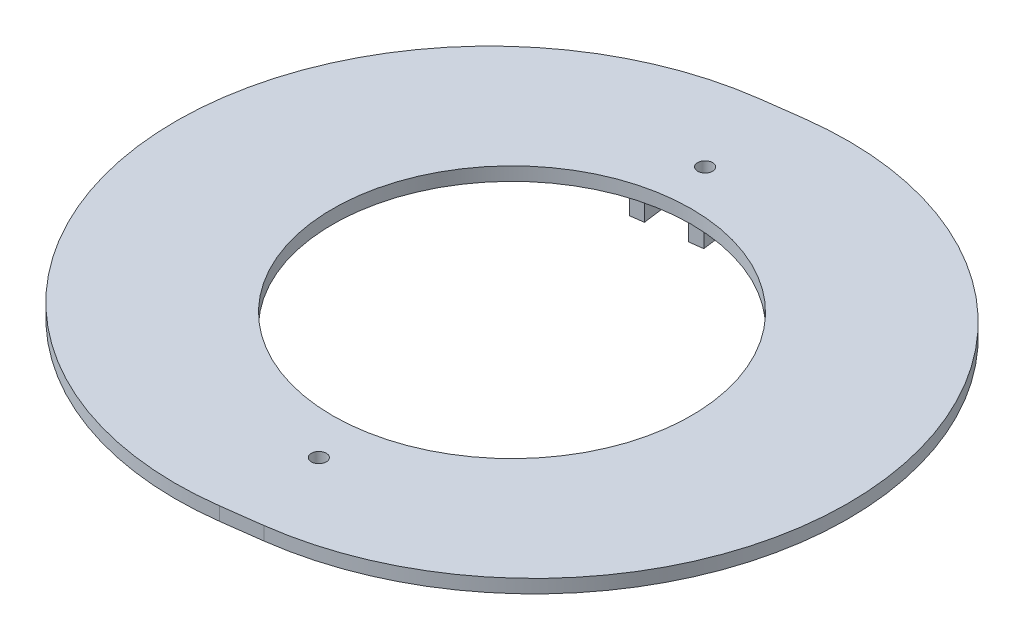
ISO-10303-21;
HEADER;
FILE_DESCRIPTION(('STEP AP214'),'2;1');
FILE_NAME('part.step','',(''),(''),'','','');
FILE_SCHEMA(('AUTOMOTIVE_DESIGN { 1 0 10303 214 1 1 1 1 }'));
ENDSEC;
DATA;
#1=APPLICATION_CONTEXT('core data for automotive mechanical design processes');
#2=APPLICATION_PROTOCOL_DEFINITION('international standard','automotive_design',2000,#1);
#3=PRODUCT_CONTEXT('',#1,'mechanical');
#4=PRODUCT('Part','Part','',(#3));
#5=PRODUCT_RELATED_PRODUCT_CATEGORY('part','',(#4));
#6=PRODUCT_DEFINITION_FORMATION('','',#4);
#7=PRODUCT_DEFINITION_CONTEXT('part definition',#1,'design');
#8=PRODUCT_DEFINITION('design','',#6,#7);
#9=PRODUCT_DEFINITION_SHAPE('','',#8);
#10=(LENGTH_UNIT() NAMED_UNIT(*) SI_UNIT(.MILLI.,.METRE.));
#11=(NAMED_UNIT(*) PLANE_ANGLE_UNIT() SI_UNIT($,.RADIAN.));
#12=(NAMED_UNIT(*) SI_UNIT($,.STERADIAN.) SOLID_ANGLE_UNIT());
#13=UNCERTAINTY_MEASURE_WITH_UNIT(LENGTH_MEASURE(1.E-05),#10,'distance_accuracy_value','');
#14=(GEOMETRIC_REPRESENTATION_CONTEXT(3) GLOBAL_UNCERTAINTY_ASSIGNED_CONTEXT((#13)) GLOBAL_UNIT_ASSIGNED_CONTEXT((#10,
#11,#12)) REPRESENTATION_CONTEXT('',''));
#15=CARTESIAN_POINT('',(0.,0.,0.));
#16=DIRECTION('',(0.,0.,1.));
#17=DIRECTION('',(1.,0.,0.));
#18=AXIS2_PLACEMENT_3D('',#15,#16,#17);
#19=CARTESIAN_POINT('',(-2.2,32.0962976066643,3.6));
#20=DIRECTION('',(0.,1.,0.));
#21=DIRECTION('',(0.,0.,1.));
#22=AXIS2_PLACEMENT_3D('',#19,#20,#21);
#23=PLANE('',#22);
#24=DIRECTION('',(-0.991444861373811,0.,0.130526192220043));
#25=VECTOR('',#24,1.);
#26=CARTESIAN_POINT('',(-0.451723656398434,32.0962976066643,-16.830232105287));
#27=LINE('',#26,#25);
#28=CARTESIAN_POINT('',(1.03544363566241,32.0962976066643,-17.0260213936171));
#29=VERTEX_POINT('',#28);
#30=CARTESIAN_POINT('',(-0.451723656398434,32.0962976066643,-16.830232105287));
#31=VERTEX_POINT('',#30);
#32=EDGE_CURVE('E191',#29,#31,#27,.T.);
#33=ORIENTED_EDGE('',*,*,#32,.F.);
#34=DIRECTION('',(0.130526192220045,0.,0.991444861373811));
#35=VECTOR('',#34,1.);
#36=CARTESIAN_POINT('',(1.03544363566241,32.0962976066643,-17.0260213936171));
#37=LINE('',#36,#35);
#38=CARTESIAN_POINT('',(0.382812674562175,32.0962976066643,-21.9832457004862));
#39=VERTEX_POINT('',#38);
#40=EDGE_CURVE('E204',#39,#29,#37,.T.);
#41=ORIENTED_EDGE('',*,*,#40,.F.);
#42=DIRECTION('',(0.991444861373811,0.,-0.130526192220045));
#43=VECTOR('',#42,1.);
#44=CARTESIAN_POINT('',(-1.10435461749866,32.0962976066643,-21.7874564121561));
#45=LINE('',#44,#43);
#46=CARTESIAN_POINT('',(-1.10435461749866,32.0962976066643,-21.7874564121561));
#47=VERTEX_POINT('',#46);
#48=EDGE_CURVE('E213',#47,#39,#45,.T.);
#49=ORIENTED_EDGE('',*,*,#48,.F.);
#50=DIRECTION('',(-0.130526192220045,0.,-0.991444861373811));
#51=VECTOR('',#50,1.);
#52=CARTESIAN_POINT('',(-0.451723656398434,32.0962976066643,-16.830232105287));
#53=LINE('',#52,#51);
#54=EDGE_CURVE('E194',#31,#47,#53,.T.);
#55=ORIENTED_EDGE('',*,*,#54,.F.);
#56=EDGE_LOOP('',(#33,#41,#49,#55));
#57=FACE_BOUND('',#56,.T.);
#58=DIRECTION('',(-0.991444861373812,0.,0.130526192220043));
#59=VECTOR('',#58,1.);
#60=CARTESIAN_POINT('',(1.06671200754344,32.0962976066643,28.4131411663879));
#61=LINE('',#60,#59);
#62=CARTESIAN_POINT('',(1.06671200754344,32.0962976066643,28.4131411663879));
#63=VERTEX_POINT('',#62);
#64=CARTESIAN_POINT('',(-0.420455284517288,32.0962976066643,28.6089304547179));
#65=VERTEX_POINT('',#64);
#66=EDGE_CURVE('E262',#63,#65,#61,.T.);
#67=ORIENTED_EDGE('',*,*,#66,.F.);
#68=DIRECTION('',(0.130526192220045,0.,0.991444861373811));
#69=VECTOR('',#68,1.);
#70=CARTESIAN_POINT('',(1.06671200754344,32.0962976066643,28.4131411663879));
#71=LINE('',#70,#69);
#72=CARTESIAN_POINT('',(0.414081046443206,32.0962976066643,23.4559168595188));
#73=VERTEX_POINT('',#72);
#74=EDGE_CURVE('E267',#73,#63,#71,.T.);
#75=ORIENTED_EDGE('',*,*,#74,.F.);
#76=DIRECTION('',(0.991444861373811,0.,-0.130526192220042));
#77=VECTOR('',#76,1.);
#78=CARTESIAN_POINT('',(0.414081046443217,32.0962976066643,23.4559168595188));
#79=LINE('',#78,#77);
#80=CARTESIAN_POINT('',(-1.0730862456175,32.0962976066643,23.6517061478489));
#81=VERTEX_POINT('',#80);
#82=EDGE_CURVE('E279',#81,#73,#79,.T.);
#83=ORIENTED_EDGE('',*,*,#82,.F.);
#84=DIRECTION('',(-0.130526192220043,0.,-0.991444861373811));
#85=VECTOR('',#84,1.);
#86=CARTESIAN_POINT('',(-0.420455284517288,32.0962976066643,28.6089304547179));
#87=LINE('',#86,#85);
#88=EDGE_CURVE('E276',#65,#81,#87,.T.);
#89=ORIENTED_EDGE('',*,*,#88,.F.);
#90=EDGE_LOOP('',(#67,#75,#83,#89));
#91=FACE_BOUND('',#90,.T.);
#92=CARTESIAN_POINT('',(-2.2,32.0962976066643,3.6));
#93=DIRECTION('',(0.,1.,0.));
#94=DIRECTION('',(0.,0.,1.));
#95=AXIS2_PLACEMENT_3D('',#92,#93,#94);
#96=CIRCLE('',#95,35.0272527833824);
#97=CARTESIAN_POINT('',(-6.77197392974388,32.0962976066643,-31.127589780126));
#98=VERTEX_POINT('',#97);
#99=CARTESIAN_POINT('',(2.3719739297439,32.0962976066643,38.327589780126));
#100=VERTEX_POINT('',#99);
#101=EDGE_CURVE('E311',#98,#100,#96,.T.);
#102=ORIENTED_EDGE('',*,*,#101,.F.);
#103=DIRECTION('',(-0.991444861373811,0.,0.130526192220046));
#104=VECTOR('',#103,1.);
#105=CARTESIAN_POINT('',(-6.77197392974388,32.0962976066643,-31.127589780126));
#106=LINE('',#105,#104);
#107=CARTESIAN_POINT('',(-2.40961653969911,32.0962976066643,-31.7019050258942));
#108=VERTEX_POINT('',#107);
#109=EDGE_CURVE('E318',#108,#98,#106,.T.);
#110=ORIENTED_EDGE('',*,*,#109,.F.);
#111=CARTESIAN_POINT('',(2.16235739004478,32.0962976066643,3.0256847542318));
#112=DIRECTION('',(0.,1.,0.));
#113=DIRECTION('',(0.,0.,-1.));
#114=AXIS2_PLACEMENT_3D('',#111,#112,#113);
#115=CIRCLE('',#114,35.0272527833824);
#116=CARTESIAN_POINT('',(6.73433131978867,32.0962976066643,37.7532745343578));
#117=VERTEX_POINT('',#116);
#118=EDGE_CURVE('E329',#117,#108,#115,.T.);
#119=ORIENTED_EDGE('',*,*,#118,.F.);
#120=DIRECTION('',(0.991444861373812,0.,-0.130526192220043));
#121=VECTOR('',#120,1.);
#122=CARTESIAN_POINT('',(2.3719739297439,32.0962976066643,38.327589780126));
#123=LINE('',#122,#121);
#124=EDGE_CURVE('E327',#100,#117,#123,.T.);
#125=ORIENTED_EDGE('',*,*,#124,.F.);
#126=EDGE_LOOP('',(#102,#110,#119,#125));
#127=FACE_BOUND('',#126,.T.);
#128=CARTESIAN_POINT('',(-0.01882130497761,32.0962976066643,3.3128423771159));
#129=DIRECTION('',(0.,1.,0.));
#130=DIRECTION('',(0.,0.,1.));
#131=AXIS2_PLACEMENT_3D('',#128,#129,#130);
#132=CIRCLE('',#131,20.);
#133=CARTESIAN_POINT('',(-0.01882130497761,32.0962976066643,23.3128423771159));
#134=VERTEX_POINT('',#133);
#135=EDGE_CURVE('E305',#134,#134,#132,.T.);
#136=ORIENTED_EDGE('',*,*,#135,.T.);
#137=EDGE_LOOP('',(#136));
#138=FACE_BOUND('',#137,.T.);
#139=CARTESIAN_POINT('',(3.24789070256586,32.0962976066643,28.1259835435038));
#140=DIRECTION('',(0.,1.,0.));
#141=DIRECTION('',(0.,0.,1.));
#142=AXIS2_PLACEMENT_3D('',#139,#140,#141);
#143=CIRCLE('',#142,0.835999999999999);
#144=CARTESIAN_POINT('',(3.24789070256586,32.0962976066643,28.9619835435038));
#145=VERTEX_POINT('',#144);
#146=EDGE_CURVE('E299',#145,#145,#143,.T.);
#147=ORIENTED_EDGE('',*,*,#146,.T.);
#148=EDGE_LOOP('',(#147));
#149=FACE_BOUND('',#148,.T.);
#150=CARTESIAN_POINT('',(-3.28553331252106,32.0962976066643,-21.500298789272));
#151=DIRECTION('',(0.,1.,0.));
#152=DIRECTION('',(0.,0.,1.));
#153=AXIS2_PLACEMENT_3D('',#150,#151,#152);
#154=CIRCLE('',#153,0.836);
#155=CARTESIAN_POINT('',(-3.28553331252106,32.0962976066643,-20.664298789272));
#156=VERTEX_POINT('',#155);
#157=EDGE_CURVE('E295',#156,#156,#154,.T.);
#158=ORIENTED_EDGE('',*,*,#157,.T.);
#159=EDGE_LOOP('',(#158));
#160=FACE_BOUND('',#159,.T.);
#161=DIRECTION('',(-0.991444861373812,0.,0.130526192220041));
#162=VECTOR('',#161,1.);
#163=CARTESIAN_POINT('',(5.42906939758822,32.0962976066643,27.8388259206197));
#164=LINE('',#163,#162);
#165=CARTESIAN_POINT('',(6.91623668964892,32.0962976066643,27.6430366322896));
#166=VERTEX_POINT('',#165);
#167=CARTESIAN_POINT('',(5.42906939758822,32.0962976066643,27.8388259206197));
#168=VERTEX_POINT('',#167);
#169=EDGE_CURVE('E229',#166,#168,#164,.T.);
#170=ORIENTED_EDGE('',*,*,#169,.F.);
#171=DIRECTION('',(0.130526192220043,0.,0.991444861373811));
#172=VECTOR('',#171,1.);
#173=CARTESIAN_POINT('',(6.91623668964892,32.0962976066643,27.6430366322896));
#174=LINE('',#173,#172);
#175=CARTESIAN_POINT('',(6.26360572854871,32.0962976066643,22.6858123254206));
#176=VERTEX_POINT('',#175);
#177=EDGE_CURVE('E234',#176,#166,#174,.T.);
#178=ORIENTED_EDGE('',*,*,#177,.F.);
#179=DIRECTION('',(0.991444861373812,0.,-0.130526192220037));
#180=VECTOR('',#179,1.);
#181=CARTESIAN_POINT('',(4.77643843648799,32.0962976066643,22.8816016137506));
#182=LINE('',#181,#180);
#183=CARTESIAN_POINT('',(4.77643843648799,32.0962976066643,22.8816016137506));
#184=VERTEX_POINT('',#183);
#185=EDGE_CURVE('E246',#184,#176,#182,.T.);
#186=ORIENTED_EDGE('',*,*,#185,.F.);
#187=DIRECTION('',(-0.130526192220045,0.,-0.991444861373811));
#188=VECTOR('',#187,1.);
#189=CARTESIAN_POINT('',(5.42906939758822,32.0962976066643,27.8388259206197));
#190=LINE('',#189,#188);
#191=EDGE_CURVE('E243',#168,#184,#190,.T.);
#192=ORIENTED_EDGE('',*,*,#191,.F.);
#193=EDGE_LOOP('',(#170,#178,#186,#192));
#194=FACE_BOUND('',#193,.T.);
#195=DIRECTION('',(0.991444861373811,0.,-0.130526192220046));
#196=VECTOR('',#195,1.);
#197=CARTESIAN_POINT('',(-5.46671200754343,32.0962976066643,-21.2131411663879));
#198=LINE('',#197,#196);
#199=CARTESIAN_POINT('',(-6.953879299604,32.0962976066643,-21.0173518780579));
#200=VERTEX_POINT('',#199);
#201=CARTESIAN_POINT('',(-5.46671200754342,32.0962976066643,-21.2131411663879));
#202=VERTEX_POINT('',#201);
#203=EDGE_CURVE('E190',#200,#202,#198,.T.);
#204=ORIENTED_EDGE('',*,*,#203,.F.);
#205=DIRECTION('',(-0.130526192220045,0.,-0.991444861373811));
#206=VECTOR('',#205,1.);
#207=CARTESIAN_POINT('',(-6.953879299604,32.0962976066643,-21.0173518780579));
#208=LINE('',#207,#206);
#209=CARTESIAN_POINT('',(-6.30124833850378,32.0962976066643,-16.0601275711888));
#210=VERTEX_POINT('',#209);
#211=EDGE_CURVE('E187',#210,#200,#208,.T.);
#212=ORIENTED_EDGE('',*,*,#211,.F.);
#213=DIRECTION('',(-0.991444861373811,0.,0.130526192220046));
#214=VECTOR('',#213,1.);
#215=CARTESIAN_POINT('',(-4.81408104644321,32.0962976066643,-16.2559168595188));
#216=LINE('',#215,#214);
#217=CARTESIAN_POINT('',(-4.81408104644321,32.0962976066643,-16.2559168595188));
#218=VERTEX_POINT('',#217);
#219=EDGE_CURVE('E53',#218,#210,#216,.T.);
#220=ORIENTED_EDGE('',*,*,#219,.F.);
#221=DIRECTION('',(0.130526192220045,0.,0.991444861373811));
#222=VECTOR('',#221,1.);
#223=CARTESIAN_POINT('',(-5.46671200754343,32.0962976066643,-21.2131411663879));
#224=LINE('',#223,#222);
#225=EDGE_CURVE('E48',#202,#218,#224,.T.);
#226=ORIENTED_EDGE('',*,*,#225,.F.);
#227=EDGE_LOOP('',(#204,#212,#220,#226));
#228=FACE_BOUND('',#227,.T.);
#229=ADVANCED_FACE('F33',(#57,#91,#127,#138,#149,#160,#194,#228),#23,.F.);
#230=CARTESIAN_POINT('',(-2.2,33.5962976066643,3.6));
#231=DIRECTION('',(0.,1.,0.));
#232=DIRECTION('',(0.,0.,1.));
#233=AXIS2_PLACEMENT_3D('',#230,#231,#232);
#234=PLANE('',#233);
#235=CARTESIAN_POINT('',(3.24789070256586,33.5962976066643,28.1259835435038));
#236=DIRECTION('',(0.,1.,0.));
#237=DIRECTION('',(0.,0.,1.));
#238=AXIS2_PLACEMENT_3D('',#235,#236,#237);
#239=CIRCLE('',#238,0.835999999999999);
#240=CARTESIAN_POINT('',(3.24789070256586,33.5962976066643,28.9619835435038));
#241=VERTEX_POINT('',#240);
#242=EDGE_CURVE('E302',#241,#241,#239,.T.);
#243=ORIENTED_EDGE('',*,*,#242,.F.);
#244=EDGE_LOOP('',(#243));
#245=FACE_BOUND('',#244,.T.);
#246=CARTESIAN_POINT('',(-2.2,33.5962976066643,3.6));
#247=DIRECTION('',(0.,1.,0.));
#248=DIRECTION('',(0.,0.,1.));
#249=AXIS2_PLACEMENT_3D('',#246,#247,#248);
#250=CIRCLE('',#249,35.0272527833824);
#251=CARTESIAN_POINT('',(-6.77197392974388,33.5962976066643,-31.127589780126));
#252=VERTEX_POINT('',#251);
#253=CARTESIAN_POINT('',(2.3719739297439,33.5962976066643,38.327589780126));
#254=VERTEX_POINT('',#253);
#255=EDGE_CURVE('E314',#252,#254,#250,.T.);
#256=ORIENTED_EDGE('',*,*,#255,.T.);
#257=DIRECTION('',(0.991444861373812,0.,-0.130526192220043));
#258=VECTOR('',#257,1.);
#259=CARTESIAN_POINT('',(2.3719739297439,33.5962976066643,38.327589780126));
#260=LINE('',#259,#258);
#261=CARTESIAN_POINT('',(6.73433131978867,33.5962976066643,37.7532745343578));
#262=VERTEX_POINT('',#261);
#263=EDGE_CURVE('E317',#254,#262,#260,.T.);
#264=ORIENTED_EDGE('',*,*,#263,.T.);
#265=CARTESIAN_POINT('',(2.16235739004478,33.5962976066643,3.0256847542318));
#266=DIRECTION('',(0.,1.,0.));
#267=DIRECTION('',(0.,0.,-1.));
#268=AXIS2_PLACEMENT_3D('',#265,#266,#267);
#269=CIRCLE('',#268,35.0272527833824);
#270=CARTESIAN_POINT('',(-2.40961653969911,33.5962976066643,-31.7019050258942));
#271=VERTEX_POINT('',#270);
#272=EDGE_CURVE('E320',#262,#271,#269,.T.);
#273=ORIENTED_EDGE('',*,*,#272,.T.);
#274=DIRECTION('',(-0.991444861373811,0.,0.130526192220046));
#275=VECTOR('',#274,1.);
#276=CARTESIAN_POINT('',(-6.77197392974388,33.5962976066643,-31.127589780126));
#277=LINE('',#276,#275);
#278=EDGE_CURVE('E322',#271,#252,#277,.T.);
#279=ORIENTED_EDGE('',*,*,#278,.T.);
#280=EDGE_LOOP('',(#256,#264,#273,#279));
#281=FACE_BOUND('',#280,.T.);
#282=CARTESIAN_POINT('',(-0.01882130497761,33.5962976066643,3.3128423771159));
#283=DIRECTION('',(0.,1.,0.));
#284=DIRECTION('',(0.,0.,1.));
#285=AXIS2_PLACEMENT_3D('',#282,#283,#284);
#286=CIRCLE('',#285,20.);
#287=CARTESIAN_POINT('',(-0.01882130497761,33.5962976066643,23.3128423771159));
#288=VERTEX_POINT('',#287);
#289=EDGE_CURVE('E308',#288,#288,#286,.T.);
#290=ORIENTED_EDGE('',*,*,#289,.F.);
#291=EDGE_LOOP('',(#290));
#292=FACE_BOUND('',#291,.T.);
#293=CARTESIAN_POINT('',(-3.28553331252106,33.5962976066643,-21.500298789272));
#294=DIRECTION('',(0.,1.,0.));
#295=DIRECTION('',(0.,0.,1.));
#296=AXIS2_PLACEMENT_3D('',#293,#294,#295);
#297=CIRCLE('',#296,0.836);
#298=CARTESIAN_POINT('',(-3.28553331252106,33.5962976066643,-20.664298789272));
#299=VERTEX_POINT('',#298);
#300=EDGE_CURVE('E296',#299,#299,#297,.T.);
#301=ORIENTED_EDGE('',*,*,#300,.F.);
#302=EDGE_LOOP('',(#301));
#303=FACE_BOUND('',#302,.T.);
#304=ADVANCED_FACE('F356',(#245,#281,#292,#303),#234,.T.);
#305=CARTESIAN_POINT('',(-2.2,33.5962976066643,3.6));
#306=DIRECTION('',(0.,-1.,0.));
#307=DIRECTION('',(0.,0.,-1.));
#308=AXIS2_PLACEMENT_3D('',#305,#306,#307);
#309=CYLINDRICAL_SURFACE('',#308,35.0272527833824);
#310=ORIENTED_EDGE('',*,*,#101,.T.);
#311=DIRECTION('',(0.,-1.,0.));
#312=VECTOR('',#311,1.);
#313=CARTESIAN_POINT('',(2.3719739297439,33.5962976066643,38.327589780126));
#314=LINE('',#313,#312);
#315=EDGE_CURVE('E11',#254,#100,#314,.T.);
#316=ORIENTED_EDGE('',*,*,#315,.F.);
#317=ORIENTED_EDGE('',*,*,#255,.F.);
#318=DIRECTION('',(0.,-1.,0.));
#319=VECTOR('',#318,1.);
#320=CARTESIAN_POINT('',(-6.77197392974388,33.5962976066643,-31.127589780126));
#321=LINE('',#320,#319);
#322=EDGE_CURVE('E324',#252,#98,#321,.T.);
#323=ORIENTED_EDGE('',*,*,#322,.T.);
#324=EDGE_LOOP('',(#310,#316,#317,#323));
#325=FACE_BOUND('',#324,.T.);
#326=ADVANCED_FACE('F35',(#325),#309,.T.);
#327=CARTESIAN_POINT('',(2.3719739297439,33.5962976066643,38.327589780126));
#328=DIRECTION('',(-0.130526192220043,0.,-0.991444861373811));
#329=DIRECTION('',(-0.991444861373812,0.,0.130526192220043));
#330=AXIS2_PLACEMENT_3D('',#327,#328,#329);
#331=PLANE('',#330);
#332=ORIENTED_EDGE('',*,*,#124,.T.);
#333=DIRECTION('',(0.,-1.,0.));
#334=VECTOR('',#333,1.);
#335=CARTESIAN_POINT('',(6.73433131978867,33.5962976066643,37.7532745343578));
#336=LINE('',#335,#334);
#337=EDGE_CURVE('E41',#262,#117,#336,.T.);
#338=ORIENTED_EDGE('',*,*,#337,.F.);
#339=ORIENTED_EDGE('',*,*,#263,.F.);
#340=ORIENTED_EDGE('',*,*,#315,.T.);
#341=EDGE_LOOP('',(#332,#338,#339,#340));
#342=FACE_BOUND('',#341,.T.);
#343=ADVANCED_FACE('F358',(#342),#331,.F.);
#344=CARTESIAN_POINT('',(2.16235739004478,33.5962976066643,3.0256847542318));
#345=DIRECTION('',(0.,-1.,0.));
#346=DIRECTION('',(0.,0.,-1.));
#347=AXIS2_PLACEMENT_3D('',#344,#345,#346);
#348=CYLINDRICAL_SURFACE('',#347,35.0272527833824);
#349=ORIENTED_EDGE('',*,*,#118,.T.);
#350=DIRECTION('',(0.,-1.,0.));
#351=VECTOR('',#350,1.);
#352=CARTESIAN_POINT('',(-2.40961653969911,33.5962976066643,-31.7019050258942));
#353=LINE('',#352,#351);
#354=EDGE_CURVE('E334',#271,#108,#353,.T.);
#355=ORIENTED_EDGE('',*,*,#354,.F.);
#356=ORIENTED_EDGE('',*,*,#272,.F.);
#357=ORIENTED_EDGE('',*,*,#337,.T.);
#358=EDGE_LOOP('',(#349,#355,#356,#357));
#359=FACE_BOUND('',#358,.T.);
#360=ADVANCED_FACE('F341',(#359),#348,.T.);
#361=CARTESIAN_POINT('',(-6.77197392974388,33.5962976066643,-31.127589780126));
#362=DIRECTION('',(0.130526192220046,0.,0.991444861373811));
#363=DIRECTION('',(0.991444861373811,0.,-0.130526192220046));
#364=AXIS2_PLACEMENT_3D('',#361,#362,#363);
#365=PLANE('',#364);
#366=ORIENTED_EDGE('',*,*,#109,.T.);
#367=ORIENTED_EDGE('',*,*,#322,.F.);
#368=ORIENTED_EDGE('',*,*,#278,.F.);
#369=ORIENTED_EDGE('',*,*,#354,.T.);
#370=EDGE_LOOP('',(#366,#367,#368,#369));
#371=FACE_BOUND('',#370,.T.);
#372=ADVANCED_FACE('F350',(#371),#365,.F.);
#373=CARTESIAN_POINT('',(-0.01882130497761,33.5962976066643,3.3128423771159));
#374=DIRECTION('',(0.,-1.,0.));
#375=DIRECTION('',(0.,0.,-1.));
#376=AXIS2_PLACEMENT_3D('',#373,#374,#375);
#377=CYLINDRICAL_SURFACE('',#376,20.);
#378=ORIENTED_EDGE('',*,*,#289,.T.);
#379=EDGE_LOOP('',(#378));
#380=FACE_BOUND('',#379,.T.);
#381=ORIENTED_EDGE('',*,*,#135,.F.);
#382=EDGE_LOOP('',(#381));
#383=FACE_BOUND('',#382,.T.);
#384=ADVANCED_FACE('F377',(#380,#383),#377,.F.);
#385=CARTESIAN_POINT('',(3.24789070256586,33.5962976066643,28.1259835435038));
#386=DIRECTION('',(0.,-1.,0.));
#387=DIRECTION('',(0.,0.,-1.));
#388=AXIS2_PLACEMENT_3D('',#385,#386,#387);
#389=CYLINDRICAL_SURFACE('',#388,0.835999999999999);
#390=ORIENTED_EDGE('',*,*,#242,.T.);
#391=EDGE_LOOP('',(#390));
#392=FACE_BOUND('',#391,.T.);
#393=ORIENTED_EDGE('',*,*,#146,.F.);
#394=EDGE_LOOP('',(#393));
#395=FACE_BOUND('',#394,.T.);
#396=ADVANCED_FACE('F381',(#392,#395),#389,.F.);
#397=CARTESIAN_POINT('',(-3.28553331252106,33.5962976066643,-21.500298789272));
#398=DIRECTION('',(0.,-1.,0.));
#399=DIRECTION('',(0.,0.,-1.));
#400=AXIS2_PLACEMENT_3D('',#397,#398,#399);
#401=CYLINDRICAL_SURFACE('',#400,0.836);
#402=ORIENTED_EDGE('',*,*,#300,.T.);
#403=EDGE_LOOP('',(#402));
#404=FACE_BOUND('',#403,.T.);
#405=ORIENTED_EDGE('',*,*,#157,.F.);
#406=EDGE_LOOP('',(#405));
#407=FACE_BOUND('',#406,.T.);
#408=ADVANCED_FACE('F386',(#404,#407),#401,.F.);
#409=CARTESIAN_POINT('',(1.06671200754344,30.0962976066643,28.4131411663879));
#410=DIRECTION('',(-0.130526192220043,0.,-0.991444861373811));
#411=DIRECTION('',(-0.991444861373812,0.,0.130526192220043));
#412=AXIS2_PLACEMENT_3D('',#409,#410,#411);
#413=PLANE('',#412);
#414=ORIENTED_EDGE('',*,*,#66,.T.);
#415=DIRECTION('',(0.,1.,0.));
#416=VECTOR('',#415,1.);
#417=CARTESIAN_POINT('',(-0.420455284517288,30.0962976066643,28.6089304547179));
#418=LINE('',#417,#416);
#419=CARTESIAN_POINT('',(-0.420455284517288,30.0962976066643,28.6089304547179));
#420=VERTEX_POINT('',#419);
#421=EDGE_CURVE('E292',#420,#65,#418,.T.);
#422=ORIENTED_EDGE('',*,*,#421,.F.);
#423=DIRECTION('',(-0.991444861373812,0.,0.130526192220043));
#424=VECTOR('',#423,1.);
#425=CARTESIAN_POINT('',(1.06671200754344,30.0962976066643,28.4131411663879));
#426=LINE('',#425,#424);
#427=CARTESIAN_POINT('',(1.06671200754344,30.0962976066643,28.4131411663879));
#428=VERTEX_POINT('',#427);
#429=EDGE_CURVE('E263',#428,#420,#426,.T.);
#430=ORIENTED_EDGE('',*,*,#429,.F.);
#431=DIRECTION('',(0.,1.,0.));
#432=VECTOR('',#431,1.);
#433=CARTESIAN_POINT('',(1.06671200754344,30.0962976066643,28.4131411663879));
#434=LINE('',#433,#432);
#435=EDGE_CURVE('E273',#428,#63,#434,.T.);
#436=ORIENTED_EDGE('',*,*,#435,.T.);
#437=EDGE_LOOP('',(#414,#422,#430,#436));
#438=FACE_BOUND('',#437,.T.);
#439=ADVANCED_FACE('F393',(#438),#413,.F.);
#440=CARTESIAN_POINT('',(-0.420455284517288,30.0962976066643,28.6089304547179));
#441=DIRECTION('',(0.991444861373812,0.,-0.130526192220043));
#442=DIRECTION('',(-0.130526192220043,0.,-0.991444861373812));
#443=AXIS2_PLACEMENT_3D('',#440,#441,#442);
#444=PLANE('',#443);
#445=ORIENTED_EDGE('',*,*,#88,.T.);
#446=DIRECTION('',(0.,1.,0.));
#447=VECTOR('',#446,1.);
#448=CARTESIAN_POINT('',(-1.0730862456175,30.0962976066643,23.6517061478489));
#449=LINE('',#448,#447);
#450=CARTESIAN_POINT('',(-1.0730862456175,30.0962976066643,23.6517061478489));
#451=VERTEX_POINT('',#450);
#452=EDGE_CURVE('E289',#451,#81,#449,.T.);
#453=ORIENTED_EDGE('',*,*,#452,.F.);
#454=DIRECTION('',(-0.130526192220043,0.,-0.991444861373811));
#455=VECTOR('',#454,1.);
#456=CARTESIAN_POINT('',(-0.420455284517288,30.0962976066643,28.6089304547179));
#457=LINE('',#456,#455);
#458=EDGE_CURVE('E266',#420,#451,#457,.T.);
#459=ORIENTED_EDGE('',*,*,#458,.F.);
#460=ORIENTED_EDGE('',*,*,#421,.T.);
#461=EDGE_LOOP('',(#445,#453,#459,#460));
#462=FACE_BOUND('',#461,.T.);
#463=ADVANCED_FACE('F397',(#462),#444,.F.);
#464=CARTESIAN_POINT('',(0.414081046443217,30.0962976066643,23.4559168595188));
#465=DIRECTION('',(0.130526192220042,0.,0.991444861373812));
#466=DIRECTION('',(0.991444861373812,0.,-0.130526192220042));
#467=AXIS2_PLACEMENT_3D('',#464,#465,#466);
#468=PLANE('',#467);
#469=ORIENTED_EDGE('',*,*,#82,.T.);
#470=DIRECTION('',(0.,1.,0.));
#471=VECTOR('',#470,1.);
#472=CARTESIAN_POINT('',(0.414081046443217,30.0962976066643,23.4559168595188));
#473=LINE('',#472,#471);
#474=CARTESIAN_POINT('',(0.414081046443217,30.0962976066643,23.4559168595188));
#475=VERTEX_POINT('',#474);
#476=EDGE_CURVE('E286',#475,#73,#473,.T.);
#477=ORIENTED_EDGE('',*,*,#476,.F.);
#478=DIRECTION('',(0.991444861373811,0.,-0.130526192220042));
#479=VECTOR('',#478,1.);
#480=CARTESIAN_POINT('',(0.414081046443217,30.0962976066643,23.4559168595188));
#481=LINE('',#480,#479);
#482=EDGE_CURVE('E269',#451,#475,#481,.T.);
#483=ORIENTED_EDGE('',*,*,#482,.F.);
#484=ORIENTED_EDGE('',*,*,#452,.T.);
#485=EDGE_LOOP('',(#469,#477,#483,#484));
#486=FACE_BOUND('',#485,.T.);
#487=ADVANCED_FACE('F401',(#486),#468,.F.);
#488=CARTESIAN_POINT('',(1.06671200754344,30.0962976066643,28.4131411663879));
#489=DIRECTION('',(-0.991444861373811,0.,0.130526192220045));
#490=DIRECTION('',(0.130526192220045,0.,0.991444861373811));
#491=AXIS2_PLACEMENT_3D('',#488,#489,#490);
#492=PLANE('',#491);
#493=ORIENTED_EDGE('',*,*,#74,.T.);
#494=ORIENTED_EDGE('',*,*,#435,.F.);
#495=DIRECTION('',(0.130526192220045,0.,0.991444861373811));
#496=VECTOR('',#495,1.);
#497=CARTESIAN_POINT('',(1.06671200754344,30.0962976066643,28.4131411663879));
#498=LINE('',#497,#496);
#499=EDGE_CURVE('E271',#475,#428,#498,.T.);
#500=ORIENTED_EDGE('',*,*,#499,.F.);
#501=ORIENTED_EDGE('',*,*,#476,.T.);
#502=EDGE_LOOP('',(#493,#494,#500,#501));
#503=FACE_BOUND('',#502,.T.);
#504=ADVANCED_FACE('F405',(#503),#492,.F.);
#505=CARTESIAN_POINT('',(0.,30.0962976066643,0.));
#506=DIRECTION('',(0.,-1.,0.));
#507=DIRECTION('',(0.,0.,-1.));
#508=AXIS2_PLACEMENT_3D('',#505,#506,#507);
#509=PLANE('',#508);
#510=ORIENTED_EDGE('',*,*,#429,.T.);
#511=ORIENTED_EDGE('',*,*,#458,.T.);
#512=ORIENTED_EDGE('',*,*,#482,.T.);
#513=ORIENTED_EDGE('',*,*,#499,.T.);
#514=EDGE_LOOP('',(#510,#511,#512,#513));
#515=FACE_BOUND('',#514,.T.);
#516=ADVANCED_FACE('F409',(#515),#509,.T.);
#517=CARTESIAN_POINT('',(5.42906939758822,30.0962976066643,27.8388259206197));
#518=DIRECTION('',(-0.130526192220041,0.,-0.991444861373812));
#519=DIRECTION('',(-0.991444861373812,0.,0.130526192220041));
#520=AXIS2_PLACEMENT_3D('',#517,#518,#519);
#521=PLANE('',#520);
#522=ORIENTED_EDGE('',*,*,#169,.T.);
#523=DIRECTION('',(0.,1.,0.));
#524=VECTOR('',#523,1.);
#525=CARTESIAN_POINT('',(5.42906939758822,30.0962976066643,27.8388259206197));
#526=LINE('',#525,#524);
#527=CARTESIAN_POINT('',(5.42906939758822,30.0962976066643,27.8388259206197));
#528=VERTEX_POINT('',#527);
#529=EDGE_CURVE('E259',#528,#168,#526,.T.);
#530=ORIENTED_EDGE('',*,*,#529,.F.);
#531=DIRECTION('',(-0.991444861373812,0.,0.130526192220041));
#532=VECTOR('',#531,1.);
#533=CARTESIAN_POINT('',(5.42906939758822,30.0962976066643,27.8388259206197));
#534=LINE('',#533,#532);
#535=CARTESIAN_POINT('',(6.91623668964892,30.0962976066643,27.6430366322896));
#536=VERTEX_POINT('',#535);
#537=EDGE_CURVE('E230',#536,#528,#534,.T.);
#538=ORIENTED_EDGE('',*,*,#537,.F.);
#539=DIRECTION('',(0.,1.,0.));
#540=VECTOR('',#539,1.);
#541=CARTESIAN_POINT('',(6.91623668964892,30.0962976066643,27.6430366322896));
#542=LINE('',#541,#540);
#543=EDGE_CURVE('E240',#536,#166,#542,.T.);
#544=ORIENTED_EDGE('',*,*,#543,.T.);
#545=EDGE_LOOP('',(#522,#530,#538,#544));
#546=FACE_BOUND('',#545,.T.);
#547=ADVANCED_FACE('F413',(#546),#521,.F.);
#548=CARTESIAN_POINT('',(5.42906939758822,30.0962976066643,27.8388259206197));
#549=DIRECTION('',(0.991444861373811,0.,-0.130526192220045));
#550=DIRECTION('',(-0.130526192220045,0.,-0.991444861373811));
#551=AXIS2_PLACEMENT_3D('',#548,#549,#550);
#552=PLANE('',#551);
#553=ORIENTED_EDGE('',*,*,#191,.T.);
#554=DIRECTION('',(0.,1.,0.));
#555=VECTOR('',#554,1.);
#556=CARTESIAN_POINT('',(4.77643843648799,30.0962976066643,22.8816016137506));
#557=LINE('',#556,#555);
#558=CARTESIAN_POINT('',(4.77643843648799,30.0962976066643,22.8816016137506));
#559=VERTEX_POINT('',#558);
#560=EDGE_CURVE('E256',#559,#184,#557,.T.);
#561=ORIENTED_EDGE('',*,*,#560,.F.);
#562=DIRECTION('',(-0.130526192220045,0.,-0.991444861373811));
#563=VECTOR('',#562,1.);
#564=CARTESIAN_POINT('',(5.42906939758822,30.0962976066643,27.8388259206197));
#565=LINE('',#564,#563);
#566=EDGE_CURVE('E233',#528,#559,#565,.T.);
#567=ORIENTED_EDGE('',*,*,#566,.F.);
#568=ORIENTED_EDGE('',*,*,#529,.T.);
#569=EDGE_LOOP('',(#553,#561,#567,#568));
#570=FACE_BOUND('',#569,.T.);
#571=ADVANCED_FACE('F417',(#570),#552,.F.);
#572=CARTESIAN_POINT('',(4.77643843648799,30.0962976066643,22.8816016137506));
#573=DIRECTION('',(0.130526192220037,0.,0.991444861373812));
#574=DIRECTION('',(0.991444861373812,0.,-0.130526192220037));
#575=AXIS2_PLACEMENT_3D('',#572,#573,#574);
#576=PLANE('',#575);
#577=ORIENTED_EDGE('',*,*,#185,.T.);
#578=DIRECTION('',(0.,1.,0.));
#579=VECTOR('',#578,1.);
#580=CARTESIAN_POINT('',(6.26360572854871,30.0962976066643,22.6858123254206));
#581=LINE('',#580,#579);
#582=CARTESIAN_POINT('',(6.26360572854871,30.0962976066643,22.6858123254206));
#583=VERTEX_POINT('',#582);
#584=EDGE_CURVE('E253',#583,#176,#581,.T.);
#585=ORIENTED_EDGE('',*,*,#584,.F.);
#586=DIRECTION('',(0.991444861373812,0.,-0.130526192220037));
#587=VECTOR('',#586,1.);
#588=CARTESIAN_POINT('',(4.77643843648799,30.0962976066643,22.8816016137506));
#589=LINE('',#588,#587);
#590=EDGE_CURVE('E236',#559,#583,#589,.T.);
#591=ORIENTED_EDGE('',*,*,#590,.F.);
#592=ORIENTED_EDGE('',*,*,#560,.T.);
#593=EDGE_LOOP('',(#577,#585,#591,#592));
#594=FACE_BOUND('',#593,.T.);
#595=ADVANCED_FACE('F421',(#594),#576,.F.);
#596=CARTESIAN_POINT('',(6.91623668964892,30.0962976066643,27.6430366322896));
#597=DIRECTION('',(-0.991444861373812,0.,0.130526192220043));
#598=DIRECTION('',(0.130526192220043,0.,0.991444861373812));
#599=AXIS2_PLACEMENT_3D('',#596,#597,#598);
#600=PLANE('',#599);
#601=ORIENTED_EDGE('',*,*,#177,.T.);
#602=ORIENTED_EDGE('',*,*,#543,.F.);
#603=DIRECTION('',(0.130526192220043,0.,0.991444861373811));
#604=VECTOR('',#603,1.);
#605=CARTESIAN_POINT('',(6.91623668964892,30.0962976066643,27.6430366322896));
#606=LINE('',#605,#604);
#607=EDGE_CURVE('E238',#583,#536,#606,.T.);
#608=ORIENTED_EDGE('',*,*,#607,.F.);
#609=ORIENTED_EDGE('',*,*,#584,.T.);
#610=EDGE_LOOP('',(#601,#602,#608,#609));
#611=FACE_BOUND('',#610,.T.);
#612=ADVANCED_FACE('F425',(#611),#600,.F.);
#613=CARTESIAN_POINT('',(0.,30.0962976066643,0.));
#614=DIRECTION('',(0.,1.,0.));
#615=DIRECTION('',(0.,0.,1.));
#616=AXIS2_PLACEMENT_3D('',#613,#614,#615);
#617=PLANE('',#616);
#618=ORIENTED_EDGE('',*,*,#537,.T.);
#619=ORIENTED_EDGE('',*,*,#566,.T.);
#620=ORIENTED_EDGE('',*,*,#590,.T.);
#621=ORIENTED_EDGE('',*,*,#607,.T.);
#622=EDGE_LOOP('',(#618,#619,#620,#621));
#623=FACE_BOUND('',#622,.T.);
#624=ADVANCED_FACE('F429',(#623),#617,.F.);
#625=CARTESIAN_POINT('',(-0.451723656398434,30.0962976066643,-16.830232105287));
#626=DIRECTION('',(-0.130526192220043,0.,-0.991444861373812));
#627=DIRECTION('',(-0.991444861373812,0.,0.130526192220043));
#628=AXIS2_PLACEMENT_3D('',#625,#626,#627);
#629=PLANE('',#628);
#630=ORIENTED_EDGE('',*,*,#32,.T.);
#631=DIRECTION('',(0.,1.,0.));
#632=VECTOR('',#631,1.);
#633=CARTESIAN_POINT('',(-0.451723656398434,30.0962976066643,-16.830232105287));
#634=LINE('',#633,#632);
#635=CARTESIAN_POINT('',(-0.451723656398434,30.0962976066643,-16.830232105287));
#636=VERTEX_POINT('',#635);
#637=EDGE_CURVE('E226',#636,#31,#634,.T.);
#638=ORIENTED_EDGE('',*,*,#637,.F.);
#639=DIRECTION('',(-0.991444861373811,0.,0.130526192220043));
#640=VECTOR('',#639,1.);
#641=CARTESIAN_POINT('',(-0.451723656398434,30.0962976066643,-16.830232105287));
#642=LINE('',#641,#640);
#643=CARTESIAN_POINT('',(1.03544363566241,30.0962976066643,-17.0260213936171));
#644=VERTEX_POINT('',#643);
#645=EDGE_CURVE('E200',#644,#636,#642,.T.);
#646=ORIENTED_EDGE('',*,*,#645,.F.);
#647=DIRECTION('',(0.,1.,0.));
#648=VECTOR('',#647,1.);
#649=CARTESIAN_POINT('',(1.03544363566241,30.0962976066643,-17.0260213936171));
#650=LINE('',#649,#648);
#651=EDGE_CURVE('E209',#644,#29,#650,.T.);
#652=ORIENTED_EDGE('',*,*,#651,.T.);
#653=EDGE_LOOP('',(#630,#638,#646,#652));
#654=FACE_BOUND('',#653,.T.);
#655=ADVANCED_FACE('F433',(#654),#629,.F.);
#656=CARTESIAN_POINT('',(-0.451723656398434,30.0962976066643,-16.830232105287));
#657=DIRECTION('',(0.991444861373811,0.,-0.130526192220045));
#658=DIRECTION('',(-0.130526192220045,0.,-0.991444861373811));
#659=AXIS2_PLACEMENT_3D('',#656,#657,#658);
#660=PLANE('',#659);
#661=ORIENTED_EDGE('',*,*,#54,.T.);
#662=DIRECTION('',(0.,1.,0.));
#663=VECTOR('',#662,1.);
#664=CARTESIAN_POINT('',(-1.10435461749866,30.0962976066643,-21.7874564121561));
#665=LINE('',#664,#663);
#666=CARTESIAN_POINT('',(-1.10435461749866,30.0962976066643,-21.7874564121561));
#667=VERTEX_POINT('',#666);
#668=EDGE_CURVE('E223',#667,#47,#665,.T.);
#669=ORIENTED_EDGE('',*,*,#668,.F.);
#670=DIRECTION('',(-0.130526192220045,0.,-0.991444861373811));
#671=VECTOR('',#670,1.);
#672=CARTESIAN_POINT('',(-0.451723656398434,30.0962976066643,-16.830232105287));
#673=LINE('',#672,#671);
#674=EDGE_CURVE('E203',#636,#667,#673,.T.);
#675=ORIENTED_EDGE('',*,*,#674,.F.);
#676=ORIENTED_EDGE('',*,*,#637,.T.);
#677=EDGE_LOOP('',(#661,#669,#675,#676));
#678=FACE_BOUND('',#677,.T.);
#679=ADVANCED_FACE('F437',(#678),#660,.F.);
#680=CARTESIAN_POINT('',(-1.10435461749866,30.0962976066643,-21.7874564121561));
#681=DIRECTION('',(0.130526192220045,0.,0.991444861373811));
#682=DIRECTION('',(0.991444861373811,0.,-0.130526192220045));
#683=AXIS2_PLACEMENT_3D('',#680,#681,#682);
#684=PLANE('',#683);
#685=ORIENTED_EDGE('',*,*,#48,.T.);
#686=DIRECTION('',(0.,1.,0.));
#687=VECTOR('',#686,1.);
#688=CARTESIAN_POINT('',(0.382812674562178,30.0962976066643,-21.9832457004862));
#689=LINE('',#688,#687);
#690=CARTESIAN_POINT('',(0.382812674562178,30.0962976066643,-21.9832457004862));
#691=VERTEX_POINT('',#690);
#692=EDGE_CURVE('E220',#691,#39,#689,.T.);
#693=ORIENTED_EDGE('',*,*,#692,.F.);
#694=DIRECTION('',(0.991444861373811,0.,-0.130526192220045));
#695=VECTOR('',#694,1.);
#696=CARTESIAN_POINT('',(-1.10435461749866,30.0962976066643,-21.7874564121561));
#697=LINE('',#696,#695);
#698=EDGE_CURVE('E206',#667,#691,#697,.T.);
#699=ORIENTED_EDGE('',*,*,#698,.F.);
#700=ORIENTED_EDGE('',*,*,#668,.T.);
#701=EDGE_LOOP('',(#685,#693,#699,#700));
#702=FACE_BOUND('',#701,.T.);
#703=ADVANCED_FACE('F441',(#702),#684,.F.);
#704=CARTESIAN_POINT('',(1.03544363566241,30.0962976066643,-17.0260213936171));
#705=DIRECTION('',(-0.991444861373811,0.,0.130526192220045));
#706=DIRECTION('',(0.130526192220045,0.,0.991444861373811));
#707=AXIS2_PLACEMENT_3D('',#704,#705,#706);
#708=PLANE('',#707);
#709=ORIENTED_EDGE('',*,*,#40,.T.);
#710=ORIENTED_EDGE('',*,*,#651,.F.);
#711=DIRECTION('',(0.130526192220045,0.,0.991444861373811));
#712=VECTOR('',#711,1.);
#713=CARTESIAN_POINT('',(1.03544363566241,30.0962976066643,-17.0260213936171));
#714=LINE('',#713,#712);
#715=EDGE_CURVE('E208',#691,#644,#714,.T.);
#716=ORIENTED_EDGE('',*,*,#715,.F.);
#717=ORIENTED_EDGE('',*,*,#692,.T.);
#718=EDGE_LOOP('',(#709,#710,#716,#717));
#719=FACE_BOUND('',#718,.T.);
#720=ADVANCED_FACE('F445',(#719),#708,.F.);
#721=CARTESIAN_POINT('',(0.,30.0962976066643,0.));
#722=DIRECTION('',(0.,1.,0.));
#723=DIRECTION('',(0.,0.,1.));
#724=AXIS2_PLACEMENT_3D('',#721,#722,#723);
#725=PLANE('',#724);
#726=ORIENTED_EDGE('',*,*,#645,.T.);
#727=ORIENTED_EDGE('',*,*,#674,.T.);
#728=ORIENTED_EDGE('',*,*,#698,.T.);
#729=ORIENTED_EDGE('',*,*,#715,.T.);
#730=EDGE_LOOP('',(#726,#727,#728,#729));
#731=FACE_BOUND('',#730,.T.);
#732=ADVANCED_FACE('F449',(#731),#725,.F.);
#733=CARTESIAN_POINT('',(-5.46671200754343,30.0962976066643,-21.2131411663879));
#734=DIRECTION('',(0.130526192220046,0.,0.991444861373811));
#735=DIRECTION('',(0.991444861373811,0.,-0.130526192220046));
#736=AXIS2_PLACEMENT_3D('',#733,#734,#735);
#737=PLANE('',#736);
#738=ORIENTED_EDGE('',*,*,#203,.T.);
#739=DIRECTION('',(0.,1.,0.));
#740=VECTOR('',#739,1.);
#741=CARTESIAN_POINT('',(-5.46671200754343,30.0962976066643,-21.2131411663879));
#742=LINE('',#741,#740);
#743=CARTESIAN_POINT('',(-5.46671200754343,30.0962976066643,-21.2131411663879));
#744=VERTEX_POINT('',#743);
#745=EDGE_CURVE('E171',#744,#202,#742,.T.);
#746=ORIENTED_EDGE('',*,*,#745,.F.);
#747=DIRECTION('',(0.991444861373811,0.,-0.130526192220046));
#748=VECTOR('',#747,1.);
#749=CARTESIAN_POINT('',(-5.46671200754343,30.0962976066643,-21.2131411663879));
#750=LINE('',#749,#748);
#751=CARTESIAN_POINT('',(-6.953879299604,30.0962976066643,-21.0173518780579));
#752=VERTEX_POINT('',#751);
#753=EDGE_CURVE('E178',#752,#744,#750,.T.);
#754=ORIENTED_EDGE('',*,*,#753,.F.);
#755=DIRECTION('',(0.,1.,0.));
#756=VECTOR('',#755,1.);
#757=CARTESIAN_POINT('',(-6.953879299604,30.0962976066643,-21.0173518780579));
#758=LINE('',#757,#756);
#759=EDGE_CURVE('E635',#752,#200,#758,.T.);
#760=ORIENTED_EDGE('',*,*,#759,.T.);
#761=EDGE_LOOP('',(#738,#746,#754,#760));
#762=FACE_BOUND('',#761,.T.);
#763=ADVANCED_FACE('F189',(#762),#737,.F.);
#764=CARTESIAN_POINT('',(-5.46671200754343,30.0962976066643,-21.2131411663879));
#765=DIRECTION('',(-0.991444861373811,0.,0.130526192220045));
#766=DIRECTION('',(0.130526192220045,0.,0.991444861373811));
#767=AXIS2_PLACEMENT_3D('',#764,#765,#766);
#768=PLANE('',#767);
#769=ORIENTED_EDGE('',*,*,#225,.T.);
#770=DIRECTION('',(0.,1.,0.));
#771=VECTOR('',#770,1.);
#772=CARTESIAN_POINT('',(-4.81408104644321,30.0962976066643,-16.2559168595188));
#773=LINE('',#772,#771);
#774=CARTESIAN_POINT('',(-4.81408104644321,30.0962976066643,-16.2559168595188));
#775=VERTEX_POINT('',#774);
#776=EDGE_CURVE('E174',#775,#218,#773,.T.);
#777=ORIENTED_EDGE('',*,*,#776,.F.);
#778=DIRECTION('',(0.130526192220045,0.,0.991444861373811));
#779=VECTOR('',#778,1.);
#780=CARTESIAN_POINT('',(-5.46671200754343,30.0962976066643,-21.2131411663879));
#781=LINE('',#780,#779);
#782=EDGE_CURVE('E167',#744,#775,#781,.T.);
#783=ORIENTED_EDGE('',*,*,#782,.F.);
#784=ORIENTED_EDGE('',*,*,#745,.T.);
#785=EDGE_LOOP('',(#769,#777,#783,#784));
#786=FACE_BOUND('',#785,.T.);
#787=ADVANCED_FACE('F169',(#786),#768,.F.);
#788=CARTESIAN_POINT('',(-4.81408104644321,30.0962976066643,-16.2559168595188));
#789=DIRECTION('',(-0.130526192220046,0.,-0.991444861373811));
#790=DIRECTION('',(-0.991444861373811,0.,0.130526192220046));
#791=AXIS2_PLACEMENT_3D('',#788,#789,#790);
#792=PLANE('',#791);
#793=ORIENTED_EDGE('',*,*,#219,.T.);
#794=DIRECTION('',(0.,1.,0.));
#795=VECTOR('',#794,1.);
#796=CARTESIAN_POINT('',(-6.30124833850378,30.0962976066643,-16.0601275711888));
#797=LINE('',#796,#795);
#798=CARTESIAN_POINT('',(-6.30124833850378,30.0962976066643,-16.0601275711888));
#799=VERTEX_POINT('',#798);
#800=EDGE_CURVE('E196',#799,#210,#797,.T.);
#801=ORIENTED_EDGE('',*,*,#800,.F.);
#802=DIRECTION('',(-0.991444861373811,0.,0.130526192220046));
#803=VECTOR('',#802,1.);
#804=CARTESIAN_POINT('',(-4.81408104644321,30.0962976066643,-16.2559168595188));
#805=LINE('',#804,#803);
#806=EDGE_CURVE('E177',#775,#799,#805,.T.);
#807=ORIENTED_EDGE('',*,*,#806,.F.);
#808=ORIENTED_EDGE('',*,*,#776,.T.);
#809=EDGE_LOOP('',(#793,#801,#807,#808));
#810=FACE_BOUND('',#809,.T.);
#811=ADVANCED_FACE('F458',(#810),#792,.F.);
#812=CARTESIAN_POINT('',(-6.953879299604,30.0962976066643,-21.0173518780579));
#813=DIRECTION('',(0.991444861373811,0.,-0.130526192220045));
#814=DIRECTION('',(-0.130526192220045,0.,-0.991444861373811));
#815=AXIS2_PLACEMENT_3D('',#812,#813,#814);
#816=PLANE('',#815);
#817=ORIENTED_EDGE('',*,*,#211,.T.);
#818=ORIENTED_EDGE('',*,*,#759,.F.);
#819=DIRECTION('',(-0.130526192220045,0.,-0.991444861373811));
#820=VECTOR('',#819,1.);
#821=CARTESIAN_POINT('',(-6.953879299604,30.0962976066643,-21.0173518780579));
#822=LINE('',#821,#820);
#823=EDGE_CURVE('E183',#799,#752,#822,.T.);
#824=ORIENTED_EDGE('',*,*,#823,.F.);
#825=ORIENTED_EDGE('',*,*,#800,.T.);
#826=EDGE_LOOP('',(#817,#818,#824,#825));
#827=FACE_BOUND('',#826,.T.);
#828=ADVANCED_FACE('F461',(#827),#816,.F.);
#829=CARTESIAN_POINT('',(0.,30.0962976066643,0.));
#830=DIRECTION('',(0.,1.,0.));
#831=DIRECTION('',(0.,0.,1.));
#832=AXIS2_PLACEMENT_3D('',#829,#830,#831);
#833=PLANE('',#832);
#834=ORIENTED_EDGE('',*,*,#753,.T.);
#835=ORIENTED_EDGE('',*,*,#782,.T.);
#836=ORIENTED_EDGE('',*,*,#806,.T.);
#837=ORIENTED_EDGE('',*,*,#823,.T.);
#838=EDGE_LOOP('',(#834,#835,#836,#837));
#839=FACE_BOUND('',#838,.T.);
#840=ADVANCED_FACE('F181',(#839),#833,.F.);
#841=CLOSED_SHELL('',(#229,#304,#326,#343,#360,#372,#384,#396,#408,#439,#463,#487,#504,#516,
#547,#571,#595,#612,#624,#655,#679,#703,#720,#732,#763,#787,#811,#828,#840));
#842=MANIFOLD_SOLID_BREP('B2',#841);
#843=ADVANCED_BREP_SHAPE_REPRESENTATION('',(#18,#842),#14);
#844=SHAPE_DEFINITION_REPRESENTATION(#9,#843);
ENDSEC;
END-ISO-10303-21;
